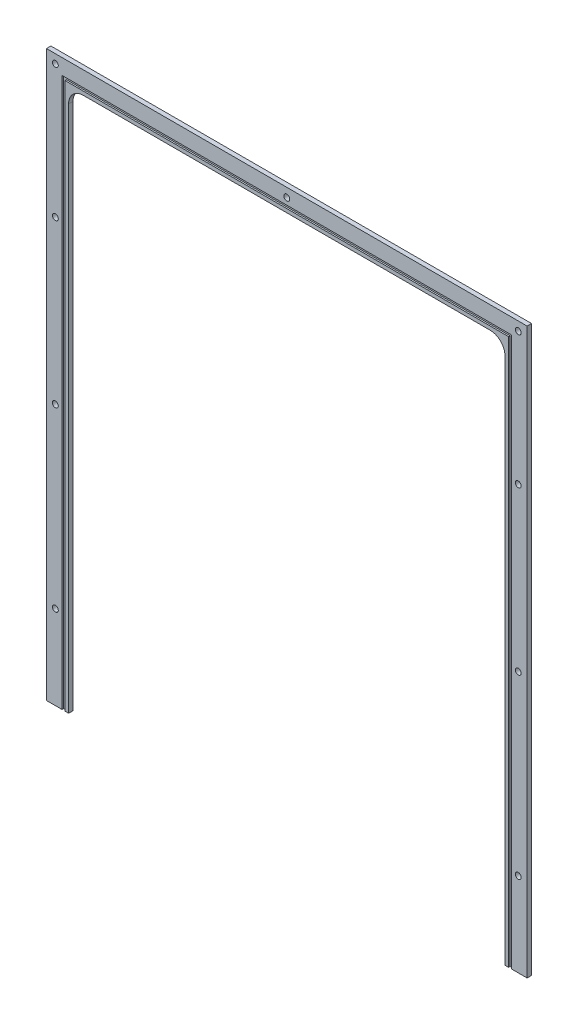
ISO-10303-21;
HEADER;
FILE_DESCRIPTION(('STEP AP214'),'2;1');
FILE_NAME('part.step','',(''),(''),'','','');
FILE_SCHEMA(('AUTOMOTIVE_DESIGN { 1 0 10303 214 1 1 1 1 }'));
ENDSEC;
DATA;
#1=APPLICATION_CONTEXT('core data for automotive mechanical design processes');
#2=APPLICATION_PROTOCOL_DEFINITION('international standard','automotive_design',2000,#1);
#3=PRODUCT_CONTEXT('',#1,'mechanical');
#4=PRODUCT('Part','Part','',(#3));
#5=PRODUCT_RELATED_PRODUCT_CATEGORY('part','',(#4));
#6=PRODUCT_DEFINITION_FORMATION('','',#4);
#7=PRODUCT_DEFINITION_CONTEXT('part definition',#1,'design');
#8=PRODUCT_DEFINITION('design','',#6,#7);
#9=PRODUCT_DEFINITION_SHAPE('','',#8);
#10=(LENGTH_UNIT() NAMED_UNIT(*) SI_UNIT(.MILLI.,.METRE.));
#11=(NAMED_UNIT(*) PLANE_ANGLE_UNIT() SI_UNIT($,.RADIAN.));
#12=(NAMED_UNIT(*) SI_UNIT($,.STERADIAN.) SOLID_ANGLE_UNIT());
#13=UNCERTAINTY_MEASURE_WITH_UNIT(LENGTH_MEASURE(1.E-05),#10,'distance_accuracy_value','');
#14=(GEOMETRIC_REPRESENTATION_CONTEXT(3) GLOBAL_UNCERTAINTY_ASSIGNED_CONTEXT((#13)) GLOBAL_UNIT_ASSIGNED_CONTEXT((#10,
#11,#12)) REPRESENTATION_CONTEXT('',''));
#15=CARTESIAN_POINT('',(0.,0.,0.));
#16=DIRECTION('',(0.,0.,1.));
#17=DIRECTION('',(1.,0.,0.));
#18=AXIS2_PLACEMENT_3D('',#15,#16,#17);
#19=CARTESIAN_POINT('',(0.,-190.,3.));
#20=DIRECTION('',(0.,-1.,0.));
#21=DIRECTION('',(0.,0.,-1.));
#22=AXIS2_PLACEMENT_3D('',#19,#20,#21);
#23=PLANE('',#22);
#24=DIRECTION('',(1.,0.,0.));
#25=VECTOR('',#24,1.);
#26=CARTESIAN_POINT('',(0.,-190.,2.));
#27=LINE('',#26,#25);
#28=CARTESIAN_POINT('',(150.5,-190.,2.));
#29=VERTEX_POINT('',#28);
#30=CARTESIAN_POINT('',(152.5,-190.,2.));
#31=VERTEX_POINT('',#30);
#32=EDGE_CURVE('E526',#29,#31,#27,.T.);
#33=ORIENTED_EDGE('',*,*,#32,.F.);
#34=DIRECTION('',(0.,0.,1.));
#35=VECTOR('',#34,1.);
#36=CARTESIAN_POINT('',(150.5,-190.,2.));
#37=LINE('',#36,#35);
#38=CARTESIAN_POINT('',(150.5,-190.,3.));
#39=VERTEX_POINT('',#38);
#40=EDGE_CURVE('E164',#29,#39,#37,.T.);
#41=ORIENTED_EDGE('',*,*,#40,.T.);
#42=DIRECTION('',(-1.,0.,0.));
#43=VECTOR('',#42,1.);
#44=CARTESIAN_POINT('',(0.,-190.,3.));
#45=LINE('',#44,#43);
#46=CARTESIAN_POINT('',(148.,-190.,3.));
#47=VERTEX_POINT('',#46);
#48=EDGE_CURVE('E583',#39,#47,#45,.T.);
#49=ORIENTED_EDGE('',*,*,#48,.T.);
#50=DIRECTION('',(0.,0.,-1.));
#51=VECTOR('',#50,1.);
#52=CARTESIAN_POINT('',(148.,-190.,3.));
#53=LINE('',#52,#51);
#54=CARTESIAN_POINT('',(148.,-190.,0.));
#55=VERTEX_POINT('',#54);
#56=EDGE_CURVE('E220',#47,#55,#53,.T.);
#57=ORIENTED_EDGE('',*,*,#56,.T.);
#58=DIRECTION('',(-1.,0.,0.));
#59=VECTOR('',#58,1.);
#60=CARTESIAN_POINT('',(0.,-190.,0.));
#61=LINE('',#60,#59);
#62=CARTESIAN_POINT('',(163.,-190.,0.));
#63=VERTEX_POINT('',#62);
#64=EDGE_CURVE('E202',#63,#55,#61,.T.);
#65=ORIENTED_EDGE('',*,*,#64,.F.);
#66=DIRECTION('',(0.,0.,-1.));
#67=VECTOR('',#66,1.);
#68=CARTESIAN_POINT('',(163.,-190.,3.));
#69=LINE('',#68,#67);
#70=CARTESIAN_POINT('',(163.,-190.,3.));
#71=VERTEX_POINT('',#70);
#72=EDGE_CURVE('E218',#71,#63,#69,.T.);
#73=ORIENTED_EDGE('',*,*,#72,.F.);
#74=CARTESIAN_POINT('',(152.5,-190.,3.));
#75=VERTEX_POINT('',#74);
#76=EDGE_CURVE('E154',#71,#75,#45,.T.);
#77=ORIENTED_EDGE('',*,*,#76,.T.);
#78=DIRECTION('',(0.,0.,1.));
#79=VECTOR('',#78,1.);
#80=CARTESIAN_POINT('',(152.5,-190.,2.));
#81=LINE('',#80,#79);
#82=EDGE_CURVE('E52',#31,#75,#81,.T.);
#83=ORIENTED_EDGE('',*,*,#82,.F.);
#84=EDGE_LOOP('',(#33,#41,#49,#57,#65,#73,#77,#83));
#85=FACE_BOUND('',#84,.T.);
#86=ADVANCED_FACE('F37',(#85),#23,.T.);
#87=CARTESIAN_POINT('',(0.,0.,3.));
#88=DIRECTION('',(0.,0.,1.));
#89=DIRECTION('',(1.,0.,0.));
#90=AXIS2_PLACEMENT_3D('',#87,#88,#89);
#91=PLANE('',#90);
#92=ORIENTED_EDGE('',*,*,#48,.F.);
#93=DIRECTION('',(0.,1.,0.));
#94=VECTOR('',#93,1.);
#95=CARTESIAN_POINT('',(150.5,0.,3.));
#96=LINE('',#95,#94);
#97=CARTESIAN_POINT('',(150.5,180.5,3.));
#98=VERTEX_POINT('',#97);
#99=EDGE_CURVE('E535',#39,#98,#96,.T.);
#100=ORIENTED_EDGE('',*,*,#99,.T.);
#101=DIRECTION('',(1.,0.,0.));
#102=VECTOR('',#101,1.);
#103=CARTESIAN_POINT('',(0.,180.5,3.));
#104=LINE('',#103,#102);
#105=CARTESIAN_POINT('',(-150.5,180.5,3.));
#106=VERTEX_POINT('',#105);
#107=EDGE_CURVE('E624',#106,#98,#104,.T.);
#108=ORIENTED_EDGE('',*,*,#107,.F.);
#109=DIRECTION('',(0.,1.,0.));
#110=VECTOR('',#109,1.);
#111=CARTESIAN_POINT('',(-150.5,0.,3.));
#112=LINE('',#111,#110);
#113=CARTESIAN_POINT('',(-150.5,-190.,3.));
#114=VERTEX_POINT('',#113);
#115=EDGE_CURVE('E626',#114,#106,#112,.T.);
#116=ORIENTED_EDGE('',*,*,#115,.F.);
#117=DIRECTION('',(-1.,0.,0.));
#118=VECTOR('',#117,1.);
#119=CARTESIAN_POINT('',(0.,-190.,3.));
#120=LINE('',#119,#118);
#121=CARTESIAN_POINT('',(-148.,-190.,3.));
#122=VERTEX_POINT('',#121);
#123=EDGE_CURVE('E158',#122,#114,#120,.T.);
#124=ORIENTED_EDGE('',*,*,#123,.F.);
#125=DIRECTION('',(0.,-1.,0.));
#126=VECTOR('',#125,1.);
#127=CARTESIAN_POINT('',(-148.,0.,3.));
#128=LINE('',#127,#126);
#129=CARTESIAN_POINT('',(-148.,168.,3.));
#130=VERTEX_POINT('',#129);
#131=EDGE_CURVE('E573',#130,#122,#128,.T.);
#132=ORIENTED_EDGE('',*,*,#131,.F.);
#133=CARTESIAN_POINT('',(-138.,168.,3.));
#134=DIRECTION('',(0.,0.,1.));
#135=DIRECTION('',(1.,0.,0.));
#136=AXIS2_PLACEMENT_3D('',#133,#134,#135);
#137=CIRCLE('',#136,10.);
#138=CARTESIAN_POINT('',(-138.,178.,3.));
#139=VERTEX_POINT('',#138);
#140=EDGE_CURVE('E575',#130,#139,#137,.F.);
#141=ORIENTED_EDGE('',*,*,#140,.T.);
#142=DIRECTION('',(1.,0.,0.));
#143=VECTOR('',#142,1.);
#144=CARTESIAN_POINT('',(0.,178.,3.));
#145=LINE('',#144,#143);
#146=CARTESIAN_POINT('',(138.,178.,3.));
#147=VERTEX_POINT('',#146);
#148=EDGE_CURVE('E230',#139,#147,#145,.T.);
#149=ORIENTED_EDGE('',*,*,#148,.T.);
#150=CARTESIAN_POINT('',(138.,168.,3.));
#151=DIRECTION('',(0.,0.,1.));
#152=DIRECTION('',(1.,0.,0.));
#153=AXIS2_PLACEMENT_3D('',#150,#151,#152);
#154=CIRCLE('',#153,10.);
#155=CARTESIAN_POINT('',(148.,168.,3.));
#156=VERTEX_POINT('',#155);
#157=EDGE_CURVE('E578',#156,#147,#154,.T.);
#158=ORIENTED_EDGE('',*,*,#157,.F.);
#159=DIRECTION('',(0.,-1.,0.));
#160=VECTOR('',#159,1.);
#161=CARTESIAN_POINT('',(148.,0.,3.));
#162=LINE('',#161,#160);
#163=EDGE_CURVE('E581',#156,#47,#162,.T.);
#164=ORIENTED_EDGE('',*,*,#163,.T.);
#165=EDGE_LOOP('',(#92,#100,#108,#116,#124,#132,#141,#149,#158,#164));
#166=FACE_BOUND('',#165,.T.);
#167=ADVANCED_FACE('F245',(#166),#91,.T.);
#168=CARTESIAN_POINT('',(157.,-133.,3.));
#169=DIRECTION('',(0.,0.,1.));
#170=DIRECTION('',(1.,0.,0.));
#171=AXIS2_PLACEMENT_3D('',#168,#169,#170);
#172=CIRCLE('',#171,2.);
#173=CARTESIAN_POINT('',(159.,-133.,3.));
#174=VERTEX_POINT('',#173);
#175=EDGE_CURVE('E214',#174,#174,#172,.T.);
#176=ORIENTED_EDGE('',*,*,#175,.F.);
#177=EDGE_LOOP('',(#176));
#178=FACE_BOUND('',#177,.T.);
#179=CARTESIAN_POINT('',(-157.,-133.,3.));
#180=DIRECTION('',(0.,0.,1.));
#181=DIRECTION('',(1.,0.,0.));
#182=AXIS2_PLACEMENT_3D('',#179,#180,#181);
#183=CIRCLE('',#182,2.);
#184=CARTESIAN_POINT('',(-155.,-133.,3.));
#185=VERTEX_POINT('',#184);
#186=EDGE_CURVE('E549',#185,#185,#183,.T.);
#187=ORIENTED_EDGE('',*,*,#186,.F.);
#188=EDGE_LOOP('',(#187));
#189=FACE_BOUND('',#188,.T.);
#190=CARTESIAN_POINT('',(0.,187.,3.));
#191=DIRECTION('',(0.,0.,1.));
#192=DIRECTION('',(1.,0.,0.));
#193=AXIS2_PLACEMENT_3D('',#190,#191,#192);
#194=CIRCLE('',#193,2.);
#195=CARTESIAN_POINT('',(1.99999999999997,187.,3.));
#196=VERTEX_POINT('',#195);
#197=EDGE_CURVE('E552',#196,#196,#194,.T.);
#198=ORIENTED_EDGE('',*,*,#197,.F.);
#199=EDGE_LOOP('',(#198));
#200=FACE_BOUND('',#199,.T.);
#201=CARTESIAN_POINT('',(157.,97.,3.));
#202=DIRECTION('',(0.,0.,1.));
#203=DIRECTION('',(1.,0.,0.));
#204=AXIS2_PLACEMENT_3D('',#201,#202,#203);
#205=CIRCLE('',#204,2.);
#206=CARTESIAN_POINT('',(159.,97.,3.));
#207=VERTEX_POINT('',#206);
#208=EDGE_CURVE('E555',#207,#207,#205,.T.);
#209=ORIENTED_EDGE('',*,*,#208,.F.);
#210=EDGE_LOOP('',(#209));
#211=FACE_BOUND('',#210,.T.);
#212=CARTESIAN_POINT('',(-157.,97.,3.));
#213=DIRECTION('',(0.,0.,1.));
#214=DIRECTION('',(1.,0.,0.));
#215=AXIS2_PLACEMENT_3D('',#212,#213,#214);
#216=CIRCLE('',#215,2.);
#217=CARTESIAN_POINT('',(-155.,97.,3.));
#218=VERTEX_POINT('',#217);
#219=EDGE_CURVE('E558',#218,#218,#216,.T.);
#220=ORIENTED_EDGE('',*,*,#219,.F.);
#221=EDGE_LOOP('',(#220));
#222=FACE_BOUND('',#221,.T.);
#223=CARTESIAN_POINT('',(157.,-13.,3.));
#224=DIRECTION('',(0.,0.,1.));
#225=DIRECTION('',(1.,0.,0.));
#226=AXIS2_PLACEMENT_3D('',#223,#224,#225);
#227=CIRCLE('',#226,2.);
#228=CARTESIAN_POINT('',(159.,-13.,3.));
#229=VERTEX_POINT('',#228);
#230=EDGE_CURVE('E561',#229,#229,#227,.T.);
#231=ORIENTED_EDGE('',*,*,#230,.F.);
#232=EDGE_LOOP('',(#231));
#233=FACE_BOUND('',#232,.T.);
#234=CARTESIAN_POINT('',(-157.,-13.,3.));
#235=DIRECTION('',(0.,0.,1.));
#236=DIRECTION('',(1.,0.,0.));
#237=AXIS2_PLACEMENT_3D('',#234,#235,#236);
#238=CIRCLE('',#237,2.);
#239=CARTESIAN_POINT('',(-155.,-13.,3.));
#240=VERTEX_POINT('',#239);
#241=EDGE_CURVE('E564',#240,#240,#238,.T.);
#242=ORIENTED_EDGE('',*,*,#241,.F.);
#243=EDGE_LOOP('',(#242));
#244=FACE_BOUND('',#243,.T.);
#245=CARTESIAN_POINT('',(-157.,187.,3.));
#246=DIRECTION('',(0.,0.,1.));
#247=DIRECTION('',(1.,0.,0.));
#248=AXIS2_PLACEMENT_3D('',#245,#246,#247);
#249=CIRCLE('',#248,2.);
#250=CARTESIAN_POINT('',(-155.,187.,3.));
#251=VERTEX_POINT('',#250);
#252=EDGE_CURVE('E567',#251,#251,#249,.T.);
#253=ORIENTED_EDGE('',*,*,#252,.F.);
#254=EDGE_LOOP('',(#253));
#255=FACE_BOUND('',#254,.T.);
#256=CARTESIAN_POINT('',(157.,187.,3.));
#257=DIRECTION('',(0.,0.,1.));
#258=DIRECTION('',(1.,0.,0.));
#259=AXIS2_PLACEMENT_3D('',#256,#257,#258);
#260=CIRCLE('',#259,2.);
#261=CARTESIAN_POINT('',(159.,187.,3.));
#262=VERTEX_POINT('',#261);
#263=EDGE_CURVE('E570',#262,#262,#260,.F.);
#264=ORIENTED_EDGE('',*,*,#263,.T.);
#265=EDGE_LOOP('',(#264));
#266=FACE_BOUND('',#265,.T.);
#267=CARTESIAN_POINT('',(-152.5,-190.,3.));
#268=VERTEX_POINT('',#267);
#269=CARTESIAN_POINT('',(-163.,-190.,3.));
#270=VERTEX_POINT('',#269);
#271=EDGE_CURVE('E146',#268,#270,#120,.T.);
#272=ORIENTED_EDGE('',*,*,#271,.F.);
#273=DIRECTION('',(0.,1.,0.));
#274=VECTOR('',#273,1.);
#275=CARTESIAN_POINT('',(-152.5,0.,3.));
#276=LINE('',#275,#274);
#277=CARTESIAN_POINT('',(-152.5,182.5,3.));
#278=VERTEX_POINT('',#277);
#279=EDGE_CURVE('E605',#268,#278,#276,.T.);
#280=ORIENTED_EDGE('',*,*,#279,.T.);
#281=DIRECTION('',(1.,0.,0.));
#282=VECTOR('',#281,1.);
#283=CARTESIAN_POINT('',(0.,182.5,3.));
#284=LINE('',#283,#282);
#285=CARTESIAN_POINT('',(152.5,182.5,3.));
#286=VERTEX_POINT('',#285);
#287=EDGE_CURVE('E643',#278,#286,#284,.T.);
#288=ORIENTED_EDGE('',*,*,#287,.T.);
#289=DIRECTION('',(0.,1.,0.));
#290=VECTOR('',#289,1.);
#291=CARTESIAN_POINT('',(152.5,0.,3.));
#292=LINE('',#291,#290);
#293=EDGE_CURVE('E595',#75,#286,#292,.T.);
#294=ORIENTED_EDGE('',*,*,#293,.F.);
#295=ORIENTED_EDGE('',*,*,#76,.F.);
#296=DIRECTION('',(0.,-1.,0.));
#297=VECTOR('',#296,1.);
#298=CARTESIAN_POINT('',(163.,0.,3.));
#299=LINE('',#298,#297);
#300=CARTESIAN_POINT('',(163.,193.,3.));
#301=VERTEX_POINT('',#300);
#302=EDGE_CURVE('E152',#301,#71,#299,.T.);
#303=ORIENTED_EDGE('',*,*,#302,.F.);
#304=DIRECTION('',(1.,0.,0.));
#305=VECTOR('',#304,1.);
#306=CARTESIAN_POINT('',(0.,193.,3.));
#307=LINE('',#306,#305);
#308=CARTESIAN_POINT('',(-163.,193.,3.));
#309=VERTEX_POINT('',#308);
#310=EDGE_CURVE('E131',#309,#301,#307,.T.);
#311=ORIENTED_EDGE('',*,*,#310,.F.);
#312=DIRECTION('',(0.,-1.,0.));
#313=VECTOR('',#312,1.);
#314=CARTESIAN_POINT('',(-163.,0.,3.));
#315=LINE('',#314,#313);
#316=EDGE_CURVE('E142',#309,#270,#315,.T.);
#317=ORIENTED_EDGE('',*,*,#316,.T.);
#318=EDGE_LOOP('',(#272,#280,#288,#294,#295,#303,#311,#317));
#319=FACE_BOUND('',#318,.T.);
#320=ADVANCED_FACE('F149',(#178,#189,#200,#211,#222,#233,#244,#255,#266,#319),#91,.T.);
#321=CARTESIAN_POINT('',(-148.,0.,3.));
#322=DIRECTION('',(1.,0.,0.));
#323=DIRECTION('',(0.,1.,0.));
#324=AXIS2_PLACEMENT_3D('',#321,#322,#323);
#325=PLANE('',#324);
#326=DIRECTION('',(0.,-1.,0.));
#327=VECTOR('',#326,1.);
#328=CARTESIAN_POINT('',(-148.,0.,0.));
#329=LINE('',#328,#327);
#330=CARTESIAN_POINT('',(-148.,168.,0.));
#331=VERTEX_POINT('',#330);
#332=CARTESIAN_POINT('',(-148.,-190.,0.));
#333=VERTEX_POINT('',#332);
#334=EDGE_CURVE('E188',#331,#333,#329,.T.);
#335=ORIENTED_EDGE('',*,*,#334,.F.);
#336=DIRECTION('',(0.,0.,-1.));
#337=VECTOR('',#336,1.);
#338=CARTESIAN_POINT('',(-148.,168.,3.));
#339=LINE('',#338,#337);
#340=EDGE_CURVE('E11',#130,#331,#339,.T.);
#341=ORIENTED_EDGE('',*,*,#340,.F.);
#342=ORIENTED_EDGE('',*,*,#131,.T.);
#343=DIRECTION('',(0.,0.,-1.));
#344=VECTOR('',#343,1.);
#345=CARTESIAN_POINT('',(-148.,-190.,3.));
#346=LINE('',#345,#344);
#347=EDGE_CURVE('E61',#122,#333,#346,.T.);
#348=ORIENTED_EDGE('',*,*,#347,.T.);
#349=EDGE_LOOP('',(#335,#341,#342,#348));
#350=FACE_BOUND('',#349,.T.);
#351=ADVANCED_FACE('F237',(#350),#325,.T.);
#352=CARTESIAN_POINT('',(-138.,168.,3.));
#353=DIRECTION('',(0.,0.,-1.));
#354=DIRECTION('',(-1.,0.,0.));
#355=AXIS2_PLACEMENT_3D('',#352,#353,#354);
#356=CYLINDRICAL_SURFACE('',#355,10.);
#357=CARTESIAN_POINT('',(-138.,168.,0.));
#358=DIRECTION('',(0.,0.,1.));
#359=DIRECTION('',(1.,0.,0.));
#360=AXIS2_PLACEMENT_3D('',#357,#358,#359);
#361=CIRCLE('',#360,10.);
#362=CARTESIAN_POINT('',(-138.,178.,0.));
#363=VERTEX_POINT('',#362);
#364=EDGE_CURVE('E190',#331,#363,#361,.F.);
#365=ORIENTED_EDGE('',*,*,#364,.T.);
#366=DIRECTION('',(0.,0.,-1.));
#367=VECTOR('',#366,1.);
#368=CARTESIAN_POINT('',(-138.,178.,3.));
#369=LINE('',#368,#367);
#370=EDGE_CURVE('E45',#139,#363,#369,.T.);
#371=ORIENTED_EDGE('',*,*,#370,.F.);
#372=ORIENTED_EDGE('',*,*,#140,.F.);
#373=ORIENTED_EDGE('',*,*,#340,.T.);
#374=EDGE_LOOP('',(#365,#371,#372,#373));
#375=FACE_BOUND('',#374,.T.);
#376=ADVANCED_FACE('F234',(#375),#356,.F.);
#377=CARTESIAN_POINT('',(0.,178.,3.));
#378=DIRECTION('',(0.,1.,0.));
#379=DIRECTION('',(-1.,0.,0.));
#380=AXIS2_PLACEMENT_3D('',#377,#378,#379);
#381=PLANE('',#380);
#382=DIRECTION('',(1.,0.,0.));
#383=VECTOR('',#382,1.);
#384=CARTESIAN_POINT('',(0.,178.,0.));
#385=LINE('',#384,#383);
#386=CARTESIAN_POINT('',(138.,178.,0.));
#387=VERTEX_POINT('',#386);
#388=EDGE_CURVE('E193',#363,#387,#385,.T.);
#389=ORIENTED_EDGE('',*,*,#388,.T.);
#390=DIRECTION('',(0.,0.,-1.));
#391=VECTOR('',#390,1.);
#392=CARTESIAN_POINT('',(138.,178.,3.));
#393=LINE('',#392,#391);
#394=EDGE_CURVE('E224',#147,#387,#393,.T.);
#395=ORIENTED_EDGE('',*,*,#394,.F.);
#396=ORIENTED_EDGE('',*,*,#148,.F.);
#397=ORIENTED_EDGE('',*,*,#370,.T.);
#398=EDGE_LOOP('',(#389,#395,#396,#397));
#399=FACE_BOUND('',#398,.T.);
#400=ADVANCED_FACE('F228',(#399),#381,.F.);
#401=CARTESIAN_POINT('',(138.,168.,3.));
#402=DIRECTION('',(0.,0.,-1.));
#403=DIRECTION('',(-1.,0.,0.));
#404=AXIS2_PLACEMENT_3D('',#401,#402,#403);
#405=CYLINDRICAL_SURFACE('',#404,10.);
#406=CARTESIAN_POINT('',(138.,168.,0.));
#407=DIRECTION('',(0.,0.,1.));
#408=DIRECTION('',(1.,0.,0.));
#409=AXIS2_PLACEMENT_3D('',#406,#407,#408);
#410=CIRCLE('',#409,10.);
#411=CARTESIAN_POINT('',(148.,168.,0.));
#412=VERTEX_POINT('',#411);
#413=EDGE_CURVE('E196',#412,#387,#410,.T.);
#414=ORIENTED_EDGE('',*,*,#413,.F.);
#415=DIRECTION('',(0.,0.,-1.));
#416=VECTOR('',#415,1.);
#417=CARTESIAN_POINT('',(148.,168.,3.));
#418=LINE('',#417,#416);
#419=EDGE_CURVE('E222',#156,#412,#418,.T.);
#420=ORIENTED_EDGE('',*,*,#419,.F.);
#421=ORIENTED_EDGE('',*,*,#157,.T.);
#422=ORIENTED_EDGE('',*,*,#394,.T.);
#423=EDGE_LOOP('',(#414,#420,#421,#422));
#424=FACE_BOUND('',#423,.T.);
#425=ADVANCED_FACE('F264',(#424),#405,.F.);
#426=CARTESIAN_POINT('',(148.,0.,3.));
#427=DIRECTION('',(1.,0.,0.));
#428=DIRECTION('',(0.,1.,0.));
#429=AXIS2_PLACEMENT_3D('',#426,#427,#428);
#430=PLANE('',#429);
#431=DIRECTION('',(0.,-1.,0.));
#432=VECTOR('',#431,1.);
#433=CARTESIAN_POINT('',(148.,0.,0.));
#434=LINE('',#433,#432);
#435=EDGE_CURVE('E199',#412,#55,#434,.T.);
#436=ORIENTED_EDGE('',*,*,#435,.T.);
#437=ORIENTED_EDGE('',*,*,#56,.F.);
#438=ORIENTED_EDGE('',*,*,#163,.F.);
#439=ORIENTED_EDGE('',*,*,#419,.T.);
#440=EDGE_LOOP('',(#436,#437,#438,#439));
#441=FACE_BOUND('',#440,.T.);
#442=ADVANCED_FACE('F261',(#441),#430,.F.);
#443=CARTESIAN_POINT('',(163.,0.,3.));
#444=DIRECTION('',(1.,0.,0.));
#445=DIRECTION('',(0.,1.,0.));
#446=AXIS2_PLACEMENT_3D('',#443,#444,#445);
#447=PLANE('',#446);
#448=DIRECTION('',(0.,-1.,0.));
#449=VECTOR('',#448,1.);
#450=CARTESIAN_POINT('',(163.,0.,0.));
#451=LINE('',#450,#449);
#452=CARTESIAN_POINT('',(163.,193.,0.));
#453=VERTEX_POINT('',#452);
#454=EDGE_CURVE('E205',#453,#63,#451,.T.);
#455=ORIENTED_EDGE('',*,*,#454,.F.);
#456=DIRECTION('',(0.,0.,-1.));
#457=VECTOR('',#456,1.);
#458=CARTESIAN_POINT('',(163.,193.,3.));
#459=LINE('',#458,#457);
#460=EDGE_CURVE('E137',#301,#453,#459,.T.);
#461=ORIENTED_EDGE('',*,*,#460,.F.);
#462=ORIENTED_EDGE('',*,*,#302,.T.);
#463=ORIENTED_EDGE('',*,*,#72,.T.);
#464=EDGE_LOOP('',(#455,#461,#462,#463));
#465=FACE_BOUND('',#464,.T.);
#466=ADVANCED_FACE('F259',(#465),#447,.T.);
#467=CARTESIAN_POINT('',(0.,193.,3.));
#468=DIRECTION('',(0.,1.,0.));
#469=DIRECTION('',(-1.,0.,0.));
#470=AXIS2_PLACEMENT_3D('',#467,#468,#469);
#471=PLANE('',#470);
#472=DIRECTION('',(1.,0.,0.));
#473=VECTOR('',#472,1.);
#474=CARTESIAN_POINT('',(0.,193.,0.));
#475=LINE('',#474,#473);
#476=CARTESIAN_POINT('',(-163.,193.,0.));
#477=VERTEX_POINT('',#476);
#478=EDGE_CURVE('E133',#477,#453,#475,.T.);
#479=ORIENTED_EDGE('',*,*,#478,.F.);
#480=DIRECTION('',(0.,0.,-1.));
#481=VECTOR('',#480,1.);
#482=CARTESIAN_POINT('',(-163.,193.,3.));
#483=LINE('',#482,#481);
#484=EDGE_CURVE('E127',#309,#477,#483,.T.);
#485=ORIENTED_EDGE('',*,*,#484,.F.);
#486=ORIENTED_EDGE('',*,*,#310,.T.);
#487=ORIENTED_EDGE('',*,*,#460,.T.);
#488=EDGE_LOOP('',(#479,#485,#486,#487));
#489=FACE_BOUND('',#488,.T.);
#490=ADVANCED_FACE('F129',(#489),#471,.T.);
#491=CARTESIAN_POINT('',(-163.,0.,3.));
#492=DIRECTION('',(1.,0.,0.));
#493=DIRECTION('',(0.,1.,0.));
#494=AXIS2_PLACEMENT_3D('',#491,#492,#493);
#495=PLANE('',#494);
#496=DIRECTION('',(0.,-1.,0.));
#497=VECTOR('',#496,1.);
#498=CARTESIAN_POINT('',(-163.,0.,0.));
#499=LINE('',#498,#497);
#500=CARTESIAN_POINT('',(-163.,-190.,0.));
#501=VERTEX_POINT('',#500);
#502=EDGE_CURVE('E209',#477,#501,#499,.T.);
#503=ORIENTED_EDGE('',*,*,#502,.T.);
#504=DIRECTION('',(0.,0.,-1.));
#505=VECTOR('',#504,1.);
#506=CARTESIAN_POINT('',(-163.,-190.,3.));
#507=LINE('',#506,#505);
#508=EDGE_CURVE('E138',#270,#501,#507,.T.);
#509=ORIENTED_EDGE('',*,*,#508,.F.);
#510=ORIENTED_EDGE('',*,*,#316,.F.);
#511=ORIENTED_EDGE('',*,*,#484,.T.);
#512=EDGE_LOOP('',(#503,#509,#510,#511));
#513=FACE_BOUND('',#512,.T.);
#514=ADVANCED_FACE('F143',(#513),#495,.F.);
#515=CARTESIAN_POINT('',(157.,187.,3.));
#516=DIRECTION('',(0.,0.,-1.));
#517=DIRECTION('',(-1.,0.,0.));
#518=AXIS2_PLACEMENT_3D('',#515,#516,#517);
#519=CYLINDRICAL_SURFACE('',#518,2.);
#520=ORIENTED_EDGE('',*,*,#263,.F.);
#521=EDGE_LOOP('',(#520));
#522=FACE_BOUND('',#521,.T.);
#523=CARTESIAN_POINT('',(157.,187.,0.));
#524=DIRECTION('',(0.,0.,1.));
#525=DIRECTION('',(1.,0.,0.));
#526=AXIS2_PLACEMENT_3D('',#523,#524,#525);
#527=CIRCLE('',#526,2.);
#528=CARTESIAN_POINT('',(159.,187.,0.));
#529=VERTEX_POINT('',#528);
#530=EDGE_CURVE('E185',#529,#529,#527,.F.);
#531=ORIENTED_EDGE('',*,*,#530,.T.);
#532=EDGE_LOOP('',(#531));
#533=FACE_BOUND('',#532,.T.);
#534=ADVANCED_FACE('F299',(#522,#533),#519,.F.);
#535=CARTESIAN_POINT('',(-157.,187.,3.));
#536=DIRECTION('',(0.,0.,-1.));
#537=DIRECTION('',(-1.,0.,0.));
#538=AXIS2_PLACEMENT_3D('',#535,#536,#537);
#539=CYLINDRICAL_SURFACE('',#538,2.);
#540=ORIENTED_EDGE('',*,*,#252,.T.);
#541=EDGE_LOOP('',(#540));
#542=FACE_BOUND('',#541,.T.);
#543=CARTESIAN_POINT('',(-157.,187.,0.));
#544=DIRECTION('',(0.,0.,1.));
#545=DIRECTION('',(1.,0.,0.));
#546=AXIS2_PLACEMENT_3D('',#543,#544,#545);
#547=CIRCLE('',#546,2.);
#548=CARTESIAN_POINT('',(-155.,187.,0.));
#549=VERTEX_POINT('',#548);
#550=EDGE_CURVE('E182',#549,#549,#547,.T.);
#551=ORIENTED_EDGE('',*,*,#550,.F.);
#552=EDGE_LOOP('',(#551));
#553=FACE_BOUND('',#552,.T.);
#554=ADVANCED_FACE('F306',(#542,#553),#539,.F.);
#555=CARTESIAN_POINT('',(-157.,-13.,3.));
#556=DIRECTION('',(0.,0.,-1.));
#557=DIRECTION('',(-1.,0.,0.));
#558=AXIS2_PLACEMENT_3D('',#555,#556,#557);
#559=CYLINDRICAL_SURFACE('',#558,2.);
#560=ORIENTED_EDGE('',*,*,#241,.T.);
#561=EDGE_LOOP('',(#560));
#562=FACE_BOUND('',#561,.T.);
#563=CARTESIAN_POINT('',(-157.,-13.,0.));
#564=DIRECTION('',(0.,0.,1.));
#565=DIRECTION('',(1.,0.,0.));
#566=AXIS2_PLACEMENT_3D('',#563,#564,#565);
#567=CIRCLE('',#566,2.);
#568=CARTESIAN_POINT('',(-155.,-13.,0.));
#569=VERTEX_POINT('',#568);
#570=EDGE_CURVE('E179',#569,#569,#567,.T.);
#571=ORIENTED_EDGE('',*,*,#570,.F.);
#572=EDGE_LOOP('',(#571));
#573=FACE_BOUND('',#572,.T.);
#574=ADVANCED_FACE('F313',(#562,#573),#559,.F.);
#575=CARTESIAN_POINT('',(157.,-13.,3.));
#576=DIRECTION('',(0.,0.,-1.));
#577=DIRECTION('',(-1.,0.,0.));
#578=AXIS2_PLACEMENT_3D('',#575,#576,#577);
#579=CYLINDRICAL_SURFACE('',#578,2.);
#580=ORIENTED_EDGE('',*,*,#230,.T.);
#581=EDGE_LOOP('',(#580));
#582=FACE_BOUND('',#581,.T.);
#583=CARTESIAN_POINT('',(157.,-13.,0.));
#584=DIRECTION('',(0.,0.,1.));
#585=DIRECTION('',(1.,0.,0.));
#586=AXIS2_PLACEMENT_3D('',#583,#584,#585);
#587=CIRCLE('',#586,2.);
#588=CARTESIAN_POINT('',(159.,-13.,0.));
#589=VERTEX_POINT('',#588);
#590=EDGE_CURVE('E176',#589,#589,#587,.T.);
#591=ORIENTED_EDGE('',*,*,#590,.F.);
#592=EDGE_LOOP('',(#591));
#593=FACE_BOUND('',#592,.T.);
#594=ADVANCED_FACE('F321',(#582,#593),#579,.F.);
#595=CARTESIAN_POINT('',(-157.,97.,3.));
#596=DIRECTION('',(0.,0.,-1.));
#597=DIRECTION('',(-1.,0.,0.));
#598=AXIS2_PLACEMENT_3D('',#595,#596,#597);
#599=CYLINDRICAL_SURFACE('',#598,2.);
#600=ORIENTED_EDGE('',*,*,#219,.T.);
#601=EDGE_LOOP('',(#600));
#602=FACE_BOUND('',#601,.T.);
#603=CARTESIAN_POINT('',(-157.,97.,0.));
#604=DIRECTION('',(0.,0.,1.));
#605=DIRECTION('',(1.,0.,0.));
#606=AXIS2_PLACEMENT_3D('',#603,#604,#605);
#607=CIRCLE('',#606,2.);
#608=CARTESIAN_POINT('',(-155.,97.,0.));
#609=VERTEX_POINT('',#608);
#610=EDGE_CURVE('E173',#609,#609,#607,.T.);
#611=ORIENTED_EDGE('',*,*,#610,.F.);
#612=EDGE_LOOP('',(#611));
#613=FACE_BOUND('',#612,.T.);
#614=ADVANCED_FACE('F329',(#602,#613),#599,.F.);
#615=CARTESIAN_POINT('',(157.,97.,3.));
#616=DIRECTION('',(0.,0.,-1.));
#617=DIRECTION('',(-1.,0.,0.));
#618=AXIS2_PLACEMENT_3D('',#615,#616,#617);
#619=CYLINDRICAL_SURFACE('',#618,2.);
#620=ORIENTED_EDGE('',*,*,#208,.T.);
#621=EDGE_LOOP('',(#620));
#622=FACE_BOUND('',#621,.T.);
#623=CARTESIAN_POINT('',(157.,97.,0.));
#624=DIRECTION('',(0.,0.,1.));
#625=DIRECTION('',(1.,0.,0.));
#626=AXIS2_PLACEMENT_3D('',#623,#624,#625);
#627=CIRCLE('',#626,2.);
#628=CARTESIAN_POINT('',(159.,97.,0.));
#629=VERTEX_POINT('',#628);
#630=EDGE_CURVE('E170',#629,#629,#627,.T.);
#631=ORIENTED_EDGE('',*,*,#630,.F.);
#632=EDGE_LOOP('',(#631));
#633=FACE_BOUND('',#632,.T.);
#634=ADVANCED_FACE('F337',(#622,#633),#619,.F.);
#635=CARTESIAN_POINT('',(0.,187.,3.));
#636=DIRECTION('',(0.,0.,-1.));
#637=DIRECTION('',(-1.,0.,0.));
#638=AXIS2_PLACEMENT_3D('',#635,#636,#637);
#639=CYLINDRICAL_SURFACE('',#638,2.);
#640=ORIENTED_EDGE('',*,*,#197,.T.);
#641=EDGE_LOOP('',(#640));
#642=FACE_BOUND('',#641,.T.);
#643=CARTESIAN_POINT('',(0.,187.,0.));
#644=DIRECTION('',(0.,0.,1.));
#645=DIRECTION('',(1.,0.,0.));
#646=AXIS2_PLACEMENT_3D('',#643,#644,#645);
#647=CIRCLE('',#646,2.);
#648=CARTESIAN_POINT('',(1.99999999999997,187.,0.));
#649=VERTEX_POINT('',#648);
#650=EDGE_CURVE('E167',#649,#649,#647,.T.);
#651=ORIENTED_EDGE('',*,*,#650,.F.);
#652=EDGE_LOOP('',(#651));
#653=FACE_BOUND('',#652,.T.);
#654=ADVANCED_FACE('F345',(#642,#653),#639,.F.);
#655=CARTESIAN_POINT('',(-157.,-133.,3.));
#656=DIRECTION('',(0.,0.,-1.));
#657=DIRECTION('',(-1.,0.,0.));
#658=AXIS2_PLACEMENT_3D('',#655,#656,#657);
#659=CYLINDRICAL_SURFACE('',#658,2.);
#660=ORIENTED_EDGE('',*,*,#186,.T.);
#661=EDGE_LOOP('',(#660));
#662=FACE_BOUND('',#661,.T.);
#663=CARTESIAN_POINT('',(-157.,-133.,0.));
#664=DIRECTION('',(0.,0.,1.));
#665=DIRECTION('',(1.,0.,0.));
#666=AXIS2_PLACEMENT_3D('',#663,#664,#665);
#667=CIRCLE('',#666,2.);
#668=CARTESIAN_POINT('',(-155.,-133.,0.));
#669=VERTEX_POINT('',#668);
#670=EDGE_CURVE('E163',#669,#669,#667,.T.);
#671=ORIENTED_EDGE('',*,*,#670,.F.);
#672=EDGE_LOOP('',(#671));
#673=FACE_BOUND('',#672,.T.);
#674=ADVANCED_FACE('F353',(#662,#673),#659,.F.);
#675=CARTESIAN_POINT('',(157.,-133.,3.));
#676=DIRECTION('',(0.,0.,-1.));
#677=DIRECTION('',(-1.,0.,0.));
#678=AXIS2_PLACEMENT_3D('',#675,#676,#677);
#679=CYLINDRICAL_SURFACE('',#678,2.);
#680=ORIENTED_EDGE('',*,*,#175,.T.);
#681=EDGE_LOOP('',(#680));
#682=FACE_BOUND('',#681,.T.);
#683=CARTESIAN_POINT('',(157.,-133.,0.));
#684=DIRECTION('',(0.,0.,1.));
#685=DIRECTION('',(1.,0.,0.));
#686=AXIS2_PLACEMENT_3D('',#683,#684,#685);
#687=CIRCLE('',#686,2.);
#688=CARTESIAN_POINT('',(159.,-133.,0.));
#689=VERTEX_POINT('',#688);
#690=EDGE_CURVE('E160',#689,#689,#687,.T.);
#691=ORIENTED_EDGE('',*,*,#690,.F.);
#692=EDGE_LOOP('',(#691));
#693=FACE_BOUND('',#692,.T.);
#694=ADVANCED_FACE('F39',(#682,#693),#679,.F.);
#695=CARTESIAN_POINT('',(0.,-190.,3.));
#696=DIRECTION('',(0.,-1.,0.));
#697=DIRECTION('',(0.,0.,-1.));
#698=AXIS2_PLACEMENT_3D('',#695,#696,#697);
#699=PLANE('',#698);
#700=DIRECTION('',(0.,0.,1.));
#701=VECTOR('',#700,1.);
#702=CARTESIAN_POINT('',(-150.5,-190.,2.));
#703=LINE('',#702,#701);
#704=CARTESIAN_POINT('',(-150.5,-190.,2.));
#705=VERTEX_POINT('',#704);
#706=EDGE_CURVE('E634',#705,#114,#703,.T.);
#707=ORIENTED_EDGE('',*,*,#706,.F.);
#708=DIRECTION('',(1.,0.,0.));
#709=VECTOR('',#708,1.);
#710=CARTESIAN_POINT('',(0.,-190.,2.));
#711=LINE('',#710,#709);
#712=CARTESIAN_POINT('',(-152.5,-190.,2.));
#713=VERTEX_POINT('',#712);
#714=EDGE_CURVE('E662',#713,#705,#711,.T.);
#715=ORIENTED_EDGE('',*,*,#714,.F.);
#716=DIRECTION('',(0.,0.,1.));
#717=VECTOR('',#716,1.);
#718=CARTESIAN_POINT('',(-152.5,-190.,2.));
#719=LINE('',#718,#717);
#720=EDGE_CURVE('E601',#713,#268,#719,.T.);
#721=ORIENTED_EDGE('',*,*,#720,.T.);
#722=ORIENTED_EDGE('',*,*,#271,.T.);
#723=ORIENTED_EDGE('',*,*,#508,.T.);
#724=DIRECTION('',(-1.,0.,0.));
#725=VECTOR('',#724,1.);
#726=CARTESIAN_POINT('',(0.,-190.,0.));
#727=LINE('',#726,#725);
#728=EDGE_CURVE('E211',#333,#501,#727,.T.);
#729=ORIENTED_EDGE('',*,*,#728,.F.);
#730=ORIENTED_EDGE('',*,*,#347,.F.);
#731=ORIENTED_EDGE('',*,*,#123,.T.);
#732=EDGE_LOOP('',(#707,#715,#721,#722,#723,#729,#730,#731));
#733=FACE_BOUND('',#732,.T.);
#734=ADVANCED_FACE('F367',(#733),#699,.T.);
#735=CARTESIAN_POINT('',(0.,0.,0.));
#736=DIRECTION('',(0.,0.,1.));
#737=DIRECTION('',(1.,0.,0.));
#738=AXIS2_PLACEMENT_3D('',#735,#736,#737);
#739=PLANE('',#738);
#740=ORIENTED_EDGE('',*,*,#690,.T.);
#741=EDGE_LOOP('',(#740));
#742=FACE_BOUND('',#741,.T.);
#743=ORIENTED_EDGE('',*,*,#670,.T.);
#744=EDGE_LOOP('',(#743));
#745=FACE_BOUND('',#744,.T.);
#746=ORIENTED_EDGE('',*,*,#650,.T.);
#747=EDGE_LOOP('',(#746));
#748=FACE_BOUND('',#747,.T.);
#749=ORIENTED_EDGE('',*,*,#630,.T.);
#750=EDGE_LOOP('',(#749));
#751=FACE_BOUND('',#750,.T.);
#752=ORIENTED_EDGE('',*,*,#610,.T.);
#753=EDGE_LOOP('',(#752));
#754=FACE_BOUND('',#753,.T.);
#755=ORIENTED_EDGE('',*,*,#590,.T.);
#756=EDGE_LOOP('',(#755));
#757=FACE_BOUND('',#756,.T.);
#758=ORIENTED_EDGE('',*,*,#570,.T.);
#759=EDGE_LOOP('',(#758));
#760=FACE_BOUND('',#759,.T.);
#761=ORIENTED_EDGE('',*,*,#550,.T.);
#762=EDGE_LOOP('',(#761));
#763=FACE_BOUND('',#762,.T.);
#764=ORIENTED_EDGE('',*,*,#530,.F.);
#765=EDGE_LOOP('',(#764));
#766=FACE_BOUND('',#765,.T.);
#767=ORIENTED_EDGE('',*,*,#334,.T.);
#768=ORIENTED_EDGE('',*,*,#728,.T.);
#769=ORIENTED_EDGE('',*,*,#502,.F.);
#770=ORIENTED_EDGE('',*,*,#478,.T.);
#771=ORIENTED_EDGE('',*,*,#454,.T.);
#772=ORIENTED_EDGE('',*,*,#64,.T.);
#773=ORIENTED_EDGE('',*,*,#435,.F.);
#774=ORIENTED_EDGE('',*,*,#413,.T.);
#775=ORIENTED_EDGE('',*,*,#388,.F.);
#776=ORIENTED_EDGE('',*,*,#364,.F.);
#777=EDGE_LOOP('',(#767,#768,#769,#770,#771,#772,#773,#774,#775,#776));
#778=FACE_BOUND('',#777,.T.);
#779=ADVANCED_FACE('F236',(#742,#745,#748,#751,#754,#757,#760,#763,#766,#778),#739,.F.);
#780=CARTESIAN_POINT('',(150.5,0.,2.));
#781=DIRECTION('',(1.,0.,0.));
#782=DIRECTION('',(0.,0.,-1.));
#783=AXIS2_PLACEMENT_3D('',#780,#781,#782);
#784=PLANE('',#783);
#785=ORIENTED_EDGE('',*,*,#99,.F.);
#786=ORIENTED_EDGE('',*,*,#40,.F.);
#787=DIRECTION('',(0.,1.,0.));
#788=VECTOR('',#787,1.);
#789=CARTESIAN_POINT('',(150.5,0.,2.));
#790=LINE('',#789,#788);
#791=CARTESIAN_POINT('',(150.5,180.5,2.));
#792=VERTEX_POINT('',#791);
#793=EDGE_CURVE('E532',#29,#792,#790,.T.);
#794=ORIENTED_EDGE('',*,*,#793,.T.);
#795=DIRECTION('',(0.,0.,1.));
#796=VECTOR('',#795,1.);
#797=CARTESIAN_POINT('',(150.5,180.5,2.));
#798=LINE('',#797,#796);
#799=EDGE_CURVE('E621',#792,#98,#798,.T.);
#800=ORIENTED_EDGE('',*,*,#799,.T.);
#801=EDGE_LOOP('',(#785,#786,#794,#800));
#802=FACE_BOUND('',#801,.T.);
#803=ADVANCED_FACE('F382',(#802),#784,.T.);
#804=CARTESIAN_POINT('',(0.,180.5,2.));
#805=DIRECTION('',(0.,-1.,0.));
#806=DIRECTION('',(0.,0.,-1.));
#807=AXIS2_PLACEMENT_3D('',#804,#805,#806);
#808=PLANE('',#807);
#809=ORIENTED_EDGE('',*,*,#107,.T.);
#810=ORIENTED_EDGE('',*,*,#799,.F.);
#811=DIRECTION('',(1.,0.,0.));
#812=VECTOR('',#811,1.);
#813=CARTESIAN_POINT('',(0.,180.5,2.));
#814=LINE('',#813,#812);
#815=CARTESIAN_POINT('',(-150.5,180.5,2.));
#816=VERTEX_POINT('',#815);
#817=EDGE_CURVE('E543',#816,#792,#814,.T.);
#818=ORIENTED_EDGE('',*,*,#817,.F.);
#819=DIRECTION('',(0.,0.,1.));
#820=VECTOR('',#819,1.);
#821=CARTESIAN_POINT('',(-150.5,180.5,2.));
#822=LINE('',#821,#820);
#823=EDGE_CURVE('E632',#816,#106,#822,.T.);
#824=ORIENTED_EDGE('',*,*,#823,.T.);
#825=EDGE_LOOP('',(#809,#810,#818,#824));
#826=FACE_BOUND('',#825,.T.);
#827=ADVANCED_FACE('F389',(#826),#808,.F.);
#828=CARTESIAN_POINT('',(-150.5,0.,2.));
#829=DIRECTION('',(1.,0.,0.));
#830=DIRECTION('',(0.,0.,-1.));
#831=AXIS2_PLACEMENT_3D('',#828,#829,#830);
#832=PLANE('',#831);
#833=ORIENTED_EDGE('',*,*,#115,.T.);
#834=ORIENTED_EDGE('',*,*,#823,.F.);
#835=DIRECTION('',(0.,1.,0.));
#836=VECTOR('',#835,1.);
#837=CARTESIAN_POINT('',(-150.5,0.,2.));
#838=LINE('',#837,#836);
#839=EDGE_CURVE('E659',#705,#816,#838,.T.);
#840=ORIENTED_EDGE('',*,*,#839,.F.);
#841=ORIENTED_EDGE('',*,*,#706,.T.);
#842=EDGE_LOOP('',(#833,#834,#840,#841));
#843=FACE_BOUND('',#842,.T.);
#844=ADVANCED_FACE('F397',(#843),#832,.F.);
#845=CARTESIAN_POINT('',(-152.5,0.,2.));
#846=DIRECTION('',(1.,0.,0.));
#847=DIRECTION('',(0.,0.,-1.));
#848=AXIS2_PLACEMENT_3D('',#845,#846,#847);
#849=PLANE('',#848);
#850=ORIENTED_EDGE('',*,*,#279,.F.);
#851=ORIENTED_EDGE('',*,*,#720,.F.);
#852=DIRECTION('',(0.,1.,0.));
#853=VECTOR('',#852,1.);
#854=CARTESIAN_POINT('',(-152.5,0.,2.));
#855=LINE('',#854,#853);
#856=CARTESIAN_POINT('',(-152.5,182.5,2.));
#857=VERTEX_POINT('',#856);
#858=EDGE_CURVE('E641',#713,#857,#855,.T.);
#859=ORIENTED_EDGE('',*,*,#858,.T.);
#860=DIRECTION('',(0.,0.,1.));
#861=VECTOR('',#860,1.);
#862=CARTESIAN_POINT('',(-152.5,182.5,2.));
#863=LINE('',#862,#861);
#864=EDGE_CURVE('E541',#857,#278,#863,.T.);
#865=ORIENTED_EDGE('',*,*,#864,.T.);
#866=EDGE_LOOP('',(#850,#851,#859,#865));
#867=FACE_BOUND('',#866,.T.);
#868=ADVANCED_FACE('F405',(#867),#849,.T.);
#869=CARTESIAN_POINT('',(0.,182.5,2.));
#870=DIRECTION('',(0.,-1.,0.));
#871=DIRECTION('',(0.,0.,-1.));
#872=AXIS2_PLACEMENT_3D('',#869,#870,#871);
#873=PLANE('',#872);
#874=ORIENTED_EDGE('',*,*,#287,.F.);
#875=ORIENTED_EDGE('',*,*,#864,.F.);
#876=DIRECTION('',(1.,0.,0.));
#877=VECTOR('',#876,1.);
#878=CARTESIAN_POINT('',(0.,182.5,2.));
#879=LINE('',#878,#877);
#880=CARTESIAN_POINT('',(152.5,182.5,2.));
#881=VERTEX_POINT('',#880);
#882=EDGE_CURVE('E667',#857,#881,#879,.T.);
#883=ORIENTED_EDGE('',*,*,#882,.T.);
#884=DIRECTION('',(0.,0.,1.));
#885=VECTOR('',#884,1.);
#886=CARTESIAN_POINT('',(152.5,182.5,2.));
#887=LINE('',#886,#885);
#888=EDGE_CURVE('E538',#881,#286,#887,.T.);
#889=ORIENTED_EDGE('',*,*,#888,.T.);
#890=EDGE_LOOP('',(#874,#875,#883,#889));
#891=FACE_BOUND('',#890,.T.);
#892=ADVANCED_FACE('F413',(#891),#873,.T.);
#893=CARTESIAN_POINT('',(152.5,0.,2.));
#894=DIRECTION('',(1.,0.,0.));
#895=DIRECTION('',(0.,0.,-1.));
#896=AXIS2_PLACEMENT_3D('',#893,#894,#895);
#897=PLANE('',#896);
#898=ORIENTED_EDGE('',*,*,#293,.T.);
#899=ORIENTED_EDGE('',*,*,#888,.F.);
#900=DIRECTION('',(0.,1.,0.));
#901=VECTOR('',#900,1.);
#902=CARTESIAN_POINT('',(152.5,0.,2.));
#903=LINE('',#902,#901);
#904=EDGE_CURVE('E529',#31,#881,#903,.T.);
#905=ORIENTED_EDGE('',*,*,#904,.F.);
#906=ORIENTED_EDGE('',*,*,#82,.T.);
#907=EDGE_LOOP('',(#898,#899,#905,#906));
#908=FACE_BOUND('',#907,.T.);
#909=ADVANCED_FACE('F421',(#908),#897,.F.);
#910=CARTESIAN_POINT('',(0.,0.,2.));
#911=DIRECTION('',(0.,0.,1.));
#912=DIRECTION('',(1.,0.,0.));
#913=AXIS2_PLACEMENT_3D('',#910,#911,#912);
#914=PLANE('',#913);
#915=ORIENTED_EDGE('',*,*,#32,.T.);
#916=ORIENTED_EDGE('',*,*,#904,.T.);
#917=ORIENTED_EDGE('',*,*,#882,.F.);
#918=ORIENTED_EDGE('',*,*,#858,.F.);
#919=ORIENTED_EDGE('',*,*,#714,.T.);
#920=ORIENTED_EDGE('',*,*,#839,.T.);
#921=ORIENTED_EDGE('',*,*,#817,.T.);
#922=ORIENTED_EDGE('',*,*,#793,.F.);
#923=EDGE_LOOP('',(#915,#916,#917,#918,#919,#920,#921,#922));
#924=FACE_BOUND('',#923,.T.);
#925=ADVANCED_FACE('F429',(#924),#914,.T.);
#926=CLOSED_SHELL('',(#86,#167,#320,#351,#376,#400,#425,#442,#466,#490,#514,#534,#554,#574,#594,
#614,#634,#654,#674,#694,#734,#779,#803,#827,#844,#868,#892,#909,#925));
#927=MANIFOLD_SOLID_BREP('B2',#926);
#928=ADVANCED_BREP_SHAPE_REPRESENTATION('',(#18,#927),#14);
#929=SHAPE_DEFINITION_REPRESENTATION(#9,#928);
ENDSEC;
END-ISO-10303-21;
